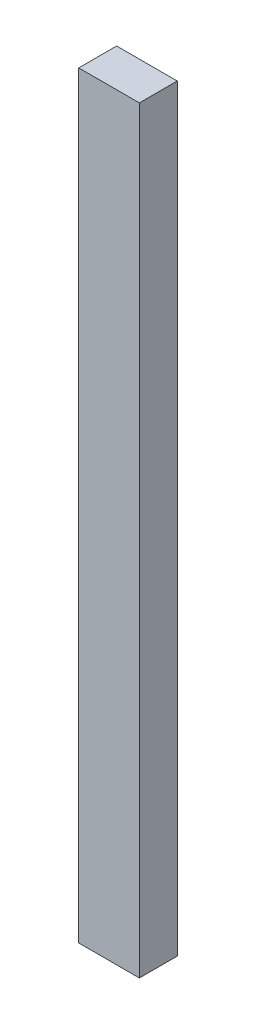
ISO-10303-21;
HEADER;
FILE_DESCRIPTION(('STEP AP214'),'2;1');
FILE_NAME('part.step','',(''),(''),'','','');
FILE_SCHEMA(('AUTOMOTIVE_DESIGN { 1 0 10303 214 1 1 1 1 }'));
ENDSEC;
DATA;
#1=APPLICATION_CONTEXT('core data for automotive mechanical design processes');
#2=APPLICATION_PROTOCOL_DEFINITION('international standard','automotive_design',2000,#1);
#3=PRODUCT_CONTEXT('',#1,'mechanical');
#4=PRODUCT('Part','Part','',(#3));
#5=PRODUCT_RELATED_PRODUCT_CATEGORY('part','',(#4));
#6=PRODUCT_DEFINITION_FORMATION('','',#4);
#7=PRODUCT_DEFINITION_CONTEXT('part definition',#1,'design');
#8=PRODUCT_DEFINITION('design','',#6,#7);
#9=PRODUCT_DEFINITION_SHAPE('','',#8);
#10=(LENGTH_UNIT() NAMED_UNIT(*) SI_UNIT(.MILLI.,.METRE.));
#11=(NAMED_UNIT(*) PLANE_ANGLE_UNIT() SI_UNIT($,.RADIAN.));
#12=(NAMED_UNIT(*) SI_UNIT($,.STERADIAN.) SOLID_ANGLE_UNIT());
#13=UNCERTAINTY_MEASURE_WITH_UNIT(LENGTH_MEASURE(1.E-05),#10,'distance_accuracy_value','');
#14=(GEOMETRIC_REPRESENTATION_CONTEXT(3) GLOBAL_UNCERTAINTY_ASSIGNED_CONTEXT((#13)) GLOBAL_UNIT_ASSIGNED_CONTEXT((#10,
#11,#12)) REPRESENTATION_CONTEXT('',''));
#15=CARTESIAN_POINT('',(0.,0.,0.));
#16=DIRECTION('',(0.,0.,1.));
#17=DIRECTION('',(1.,0.,0.));
#18=AXIS2_PLACEMENT_3D('',#15,#16,#17);
#19=CARTESIAN_POINT('',(0.,0.,25.));
#20=DIRECTION('',(1.,0.,0.));
#21=DIRECTION('',(0.,0.,-1.));
#22=AXIS2_PLACEMENT_3D('',#19,#20,#21);
#23=PLANE('',#22);
#24=DIRECTION('',(0.,-1.,0.));
#25=VECTOR('',#24,1.);
#26=CARTESIAN_POINT('',(0.,0.,0.));
#27=LINE('',#26,#25);
#28=CARTESIAN_POINT('',(0.,500.,0.));
#29=VERTEX_POINT('',#28);
#30=CARTESIAN_POINT('',(0.,0.,0.));
#31=VERTEX_POINT('',#30);
#32=EDGE_CURVE('E96',#29,#31,#27,.T.);
#33=ORIENTED_EDGE('',*,*,#32,.T.);
#34=DIRECTION('',(0.,0.,-1.));
#35=VECTOR('',#34,1.);
#36=CARTESIAN_POINT('',(0.,0.,25.));
#37=LINE('',#36,#35);
#38=CARTESIAN_POINT('',(0.,0.,25.));
#39=VERTEX_POINT('',#38);
#40=EDGE_CURVE('E11',#39,#31,#37,.T.);
#41=ORIENTED_EDGE('',*,*,#40,.F.);
#42=DIRECTION('',(0.,-1.,0.));
#43=VECTOR('',#42,1.);
#44=CARTESIAN_POINT('',(0.,0.,25.));
#45=LINE('',#44,#43);
#46=CARTESIAN_POINT('',(0.,500.,25.));
#47=VERTEX_POINT('',#46);
#48=EDGE_CURVE('E84',#47,#39,#45,.T.);
#49=ORIENTED_EDGE('',*,*,#48,.F.);
#50=DIRECTION('',(0.,0.,-1.));
#51=VECTOR('',#50,1.);
#52=CARTESIAN_POINT('',(0.,500.,25.));
#53=LINE('',#52,#51);
#54=EDGE_CURVE('E92',#47,#29,#53,.T.);
#55=ORIENTED_EDGE('',*,*,#54,.T.);
#56=EDGE_LOOP('',(#33,#41,#49,#55));
#57=FACE_BOUND('',#56,.T.);
#58=ADVANCED_FACE('F33',(#57),#23,.F.);
#59=CARTESIAN_POINT('',(0.,0.,25.));
#60=DIRECTION('',(0.,1.,0.));
#61=DIRECTION('',(0.,0.,1.));
#62=AXIS2_PLACEMENT_3D('',#59,#60,#61);
#63=PLANE('',#62);
#64=DIRECTION('',(1.,0.,0.));
#65=VECTOR('',#64,1.);
#66=CARTESIAN_POINT('',(0.,0.,0.));
#67=LINE('',#66,#65);
#68=CARTESIAN_POINT('',(40.,0.,0.));
#69=VERTEX_POINT('',#68);
#70=EDGE_CURVE('E88',#31,#69,#67,.T.);
#71=ORIENTED_EDGE('',*,*,#70,.T.);
#72=DIRECTION('',(0.,0.,-1.));
#73=VECTOR('',#72,1.);
#74=CARTESIAN_POINT('',(40.,0.,25.));
#75=LINE('',#74,#73);
#76=CARTESIAN_POINT('',(40.,0.,25.));
#77=VERTEX_POINT('',#76);
#78=EDGE_CURVE('E41',#77,#69,#75,.T.);
#79=ORIENTED_EDGE('',*,*,#78,.F.);
#80=DIRECTION('',(1.,0.,0.));
#81=VECTOR('',#80,1.);
#82=CARTESIAN_POINT('',(0.,0.,25.));
#83=LINE('',#82,#81);
#84=EDGE_CURVE('E79',#39,#77,#83,.T.);
#85=ORIENTED_EDGE('',*,*,#84,.F.);
#86=ORIENTED_EDGE('',*,*,#40,.T.);
#87=EDGE_LOOP('',(#71,#79,#85,#86));
#88=FACE_BOUND('',#87,.T.);
#89=ADVANCED_FACE('F87',(#88),#63,.F.);
#90=CARTESIAN_POINT('',(40.,0.,25.));
#91=DIRECTION('',(-1.,0.,0.));
#92=DIRECTION('',(0.,0.,1.));
#93=AXIS2_PLACEMENT_3D('',#90,#91,#92);
#94=PLANE('',#93);
#95=DIRECTION('',(0.,1.,0.));
#96=VECTOR('',#95,1.);
#97=CARTESIAN_POINT('',(40.,0.,0.));
#98=LINE('',#97,#96);
#99=CARTESIAN_POINT('',(40.,500.,0.));
#100=VERTEX_POINT('',#99);
#101=EDGE_CURVE('E66',#69,#100,#98,.T.);
#102=ORIENTED_EDGE('',*,*,#101,.T.);
#103=DIRECTION('',(0.,0.,-1.));
#104=VECTOR('',#103,1.);
#105=CARTESIAN_POINT('',(40.,500.,25.));
#106=LINE('',#105,#104);
#107=CARTESIAN_POINT('',(40.,500.,25.));
#108=VERTEX_POINT('',#107);
#109=EDGE_CURVE('E89',#108,#100,#106,.T.);
#110=ORIENTED_EDGE('',*,*,#109,.F.);
#111=DIRECTION('',(0.,1.,0.));
#112=VECTOR('',#111,1.);
#113=CARTESIAN_POINT('',(40.,0.,25.));
#114=LINE('',#113,#112);
#115=EDGE_CURVE('E82',#77,#108,#114,.T.);
#116=ORIENTED_EDGE('',*,*,#115,.F.);
#117=ORIENTED_EDGE('',*,*,#78,.T.);
#118=EDGE_LOOP('',(#102,#110,#116,#117));
#119=FACE_BOUND('',#118,.T.);
#120=ADVANCED_FACE('F90',(#119),#94,.F.);
#121=CARTESIAN_POINT('',(0.,500.,25.));
#122=DIRECTION('',(0.,-1.,0.));
#123=DIRECTION('',(0.,0.,-1.));
#124=AXIS2_PLACEMENT_3D('',#121,#122,#123);
#125=PLANE('',#124);
#126=DIRECTION('',(-1.,0.,0.));
#127=VECTOR('',#126,1.);
#128=CARTESIAN_POINT('',(0.,500.,0.));
#129=LINE('',#128,#127);
#130=EDGE_CURVE('E72',#100,#29,#129,.T.);
#131=ORIENTED_EDGE('',*,*,#130,.T.);
#132=ORIENTED_EDGE('',*,*,#54,.F.);
#133=DIRECTION('',(-1.,0.,0.));
#134=VECTOR('',#133,1.);
#135=CARTESIAN_POINT('',(0.,500.,25.));
#136=LINE('',#135,#134);
#137=EDGE_CURVE('E49',#108,#47,#136,.T.);
#138=ORIENTED_EDGE('',*,*,#137,.F.);
#139=ORIENTED_EDGE('',*,*,#109,.T.);
#140=EDGE_LOOP('',(#131,#132,#138,#139));
#141=FACE_BOUND('',#140,.T.);
#142=ADVANCED_FACE('F103',(#141),#125,.F.);
#143=CARTESIAN_POINT('',(0.,0.,25.));
#144=DIRECTION('',(0.,0.,-1.));
#145=DIRECTION('',(-1.,0.,0.));
#146=AXIS2_PLACEMENT_3D('',#143,#144,#145);
#147=PLANE('',#146);
#148=ORIENTED_EDGE('',*,*,#48,.T.);
#149=ORIENTED_EDGE('',*,*,#84,.T.);
#150=ORIENTED_EDGE('',*,*,#115,.T.);
#151=ORIENTED_EDGE('',*,*,#137,.T.);
#152=EDGE_LOOP('',(#148,#149,#150,#151));
#153=FACE_BOUND('',#152,.T.);
#154=ADVANCED_FACE('F80',(#153),#147,.F.);
#155=CARTESIAN_POINT('',(0.,0.,0.));
#156=DIRECTION('',(0.,0.,-1.));
#157=DIRECTION('',(-1.,0.,0.));
#158=AXIS2_PLACEMENT_3D('',#155,#156,#157);
#159=PLANE('',#158);
#160=ORIENTED_EDGE('',*,*,#32,.F.);
#161=ORIENTED_EDGE('',*,*,#130,.F.);
#162=ORIENTED_EDGE('',*,*,#101,.F.);
#163=ORIENTED_EDGE('',*,*,#70,.F.);
#164=EDGE_LOOP('',(#160,#161,#162,#163));
#165=FACE_BOUND('',#164,.T.);
#166=ADVANCED_FACE('F106',(#165),#159,.T.);
#167=CLOSED_SHELL('',(#58,#89,#120,#142,#154,#166));
#168=MANIFOLD_SOLID_BREP('B2',#167);
#169=ADVANCED_BREP_SHAPE_REPRESENTATION('',(#18,#168),#14);
#170=SHAPE_DEFINITION_REPRESENTATION(#9,#169);
ENDSEC;
END-ISO-10303-21;
